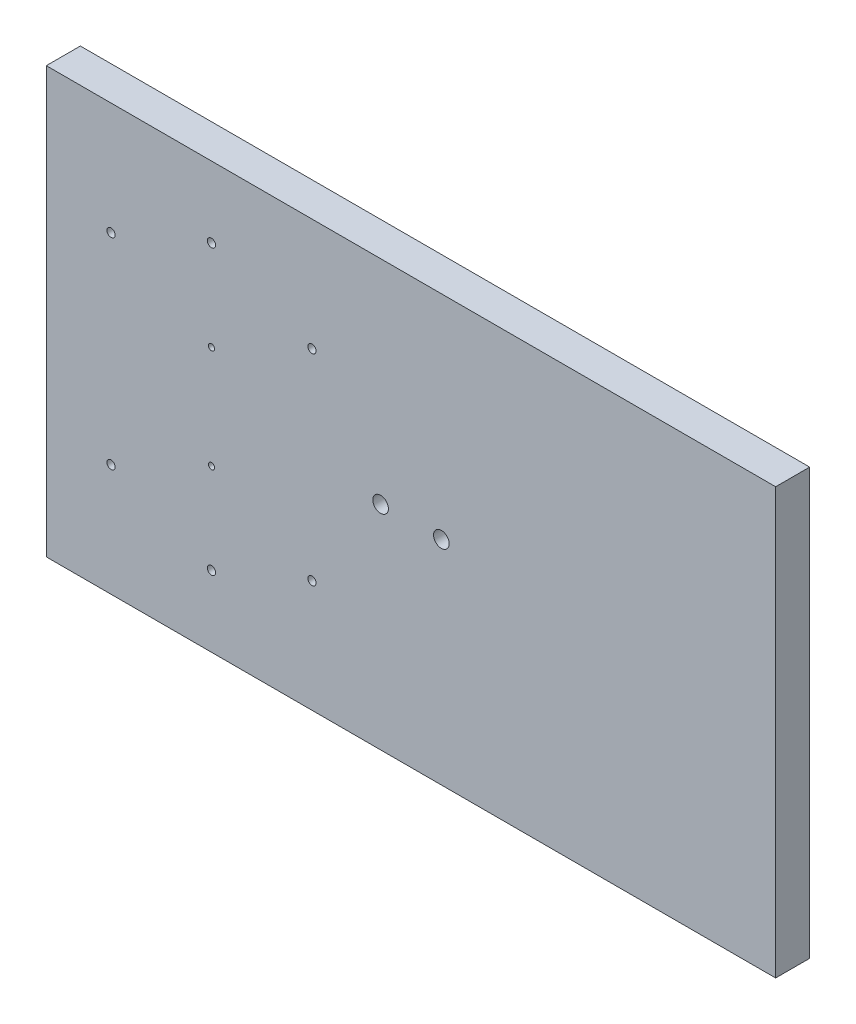
ISO-10303-21;
HEADER;
FILE_DESCRIPTION(('STEP AP214'),'2;1');
FILE_NAME('part.step','',(''),(''),'','','');
FILE_SCHEMA(('AUTOMOTIVE_DESIGN { 1 0 10303 214 1 1 1 1 }'));
ENDSEC;
DATA;
#1=APPLICATION_CONTEXT('core data for automotive mechanical design processes');
#2=APPLICATION_PROTOCOL_DEFINITION('international standard','automotive_design',2000,#1);
#3=PRODUCT_CONTEXT('',#1,'mechanical');
#4=PRODUCT('Part','Part','',(#3));
#5=PRODUCT_RELATED_PRODUCT_CATEGORY('part','',(#4));
#6=PRODUCT_DEFINITION_FORMATION('','',#4);
#7=PRODUCT_DEFINITION_CONTEXT('part definition',#1,'design');
#8=PRODUCT_DEFINITION('design','',#6,#7);
#9=PRODUCT_DEFINITION_SHAPE('','',#8);
#10=(LENGTH_UNIT() NAMED_UNIT(*) SI_UNIT(.MILLI.,.METRE.));
#11=(NAMED_UNIT(*) PLANE_ANGLE_UNIT() SI_UNIT($,.RADIAN.));
#12=(NAMED_UNIT(*) SI_UNIT($,.STERADIAN.) SOLID_ANGLE_UNIT());
#13=UNCERTAINTY_MEASURE_WITH_UNIT(LENGTH_MEASURE(1.E-05),#10,'distance_accuracy_value','');
#14=(GEOMETRIC_REPRESENTATION_CONTEXT(3) GLOBAL_UNCERTAINTY_ASSIGNED_CONTEXT((#13)) GLOBAL_UNIT_ASSIGNED_CONTEXT((#10,
#11,#12)) REPRESENTATION_CONTEXT('',''));
#15=CARTESIAN_POINT('',(0.,0.,0.));
#16=DIRECTION('',(0.,0.,1.));
#17=DIRECTION('',(1.,0.,0.));
#18=AXIS2_PLACEMENT_3D('',#15,#16,#17);
#19=CARTESIAN_POINT('',(152.4,-88.9,14.224));
#20=DIRECTION('',(-1.,0.,0.));
#21=DIRECTION('',(0.,0.,1.));
#22=AXIS2_PLACEMENT_3D('',#19,#20,#21);
#23=PLANE('',#22);
#24=DIRECTION('',(0.,1.,0.));
#25=VECTOR('',#24,1.);
#26=CARTESIAN_POINT('',(152.4,-88.9,0.));
#27=LINE('',#26,#25);
#28=CARTESIAN_POINT('',(152.4,-88.9,0.));
#29=VERTEX_POINT('',#28);
#30=CARTESIAN_POINT('',(152.4,88.9,0.));
#31=VERTEX_POINT('',#30);
#32=EDGE_CURVE('E168',#29,#31,#27,.T.);
#33=ORIENTED_EDGE('',*,*,#32,.T.);
#34=DIRECTION('',(0.,0.,-1.));
#35=VECTOR('',#34,1.);
#36=CARTESIAN_POINT('',(152.4,88.9,14.224));
#37=LINE('',#36,#35);
#38=CARTESIAN_POINT('',(152.4,88.9,14.224));
#39=VERTEX_POINT('',#38);
#40=EDGE_CURVE('E11',#39,#31,#37,.T.);
#41=ORIENTED_EDGE('',*,*,#40,.F.);
#42=DIRECTION('',(0.,1.,0.));
#43=VECTOR('',#42,1.);
#44=CARTESIAN_POINT('',(152.4,-88.9,14.224));
#45=LINE('',#44,#43);
#46=CARTESIAN_POINT('',(152.4,-88.9,14.224));
#47=VERTEX_POINT('',#46);
#48=EDGE_CURVE('E169',#47,#39,#45,.T.);
#49=ORIENTED_EDGE('',*,*,#48,.F.);
#50=DIRECTION('',(0.,0.,-1.));
#51=VECTOR('',#50,1.);
#52=CARTESIAN_POINT('',(152.4,-88.9,14.224));
#53=LINE('',#52,#51);
#54=EDGE_CURVE('E175',#47,#29,#53,.T.);
#55=ORIENTED_EDGE('',*,*,#54,.T.);
#56=EDGE_LOOP('',(#33,#41,#49,#55));
#57=FACE_BOUND('',#56,.T.);
#58=ADVANCED_FACE('F37',(#57),#23,.F.);
#59=CARTESIAN_POINT('',(-152.4,88.9,14.224));
#60=DIRECTION('',(0.,-1.,0.));
#61=DIRECTION('',(0.,0.,-1.));
#62=AXIS2_PLACEMENT_3D('',#59,#60,#61);
#63=PLANE('',#62);
#64=DIRECTION('',(-1.,0.,0.));
#65=VECTOR('',#64,1.);
#66=CARTESIAN_POINT('',(-152.4,88.9,0.));
#67=LINE('',#66,#65);
#68=CARTESIAN_POINT('',(-152.4,88.9,0.));
#69=VERTEX_POINT('',#68);
#70=EDGE_CURVE('E178',#31,#69,#67,.T.);
#71=ORIENTED_EDGE('',*,*,#70,.T.);
#72=DIRECTION('',(0.,0.,-1.));
#73=VECTOR('',#72,1.);
#74=CARTESIAN_POINT('',(-152.4,88.9,14.224));
#75=LINE('',#74,#73);
#76=CARTESIAN_POINT('',(-152.4,88.9,14.224));
#77=VERTEX_POINT('',#76);
#78=EDGE_CURVE('E45',#77,#69,#75,.T.);
#79=ORIENTED_EDGE('',*,*,#78,.F.);
#80=DIRECTION('',(-1.,0.,0.));
#81=VECTOR('',#80,1.);
#82=CARTESIAN_POINT('',(-152.4,88.9,14.224));
#83=LINE('',#82,#81);
#84=EDGE_CURVE('E84',#39,#77,#83,.T.);
#85=ORIENTED_EDGE('',*,*,#84,.F.);
#86=ORIENTED_EDGE('',*,*,#40,.T.);
#87=EDGE_LOOP('',(#71,#79,#85,#86));
#88=FACE_BOUND('',#87,.T.);
#89=ADVANCED_FACE('F202',(#88),#63,.F.);
#90=CARTESIAN_POINT('',(-152.4,-88.9,14.224));
#91=DIRECTION('',(1.,0.,0.));
#92=DIRECTION('',(0.,0.,-1.));
#93=AXIS2_PLACEMENT_3D('',#90,#91,#92);
#94=PLANE('',#93);
#95=DIRECTION('',(0.,-1.,0.));
#96=VECTOR('',#95,1.);
#97=CARTESIAN_POINT('',(-152.4,-88.9,0.));
#98=LINE('',#97,#96);
#99=CARTESIAN_POINT('',(-152.4,-88.9,0.));
#100=VERTEX_POINT('',#99);
#101=EDGE_CURVE('E71',#69,#100,#98,.T.);
#102=ORIENTED_EDGE('',*,*,#101,.T.);
#103=DIRECTION('',(0.,0.,-1.));
#104=VECTOR('',#103,1.);
#105=CARTESIAN_POINT('',(-152.4,-88.9,14.224));
#106=LINE('',#105,#104);
#107=CARTESIAN_POINT('',(-152.4,-88.9,14.224));
#108=VERTEX_POINT('',#107);
#109=EDGE_CURVE('E183',#108,#100,#106,.T.);
#110=ORIENTED_EDGE('',*,*,#109,.F.);
#111=DIRECTION('',(0.,-1.,0.));
#112=VECTOR('',#111,1.);
#113=CARTESIAN_POINT('',(-152.4,-88.9,14.224));
#114=LINE('',#113,#112);
#115=EDGE_CURVE('E172',#77,#108,#114,.T.);
#116=ORIENTED_EDGE('',*,*,#115,.F.);
#117=ORIENTED_EDGE('',*,*,#78,.T.);
#118=EDGE_LOOP('',(#102,#110,#116,#117));
#119=FACE_BOUND('',#118,.T.);
#120=ADVANCED_FACE('F185',(#119),#94,.F.);
#121=CARTESIAN_POINT('',(-152.4,-88.9,14.224));
#122=DIRECTION('',(0.,1.,0.));
#123=DIRECTION('',(0.,0.,1.));
#124=AXIS2_PLACEMENT_3D('',#121,#122,#123);
#125=PLANE('',#124);
#126=DIRECTION('',(1.,0.,0.));
#127=VECTOR('',#126,1.);
#128=CARTESIAN_POINT('',(-152.4,-88.9,0.));
#129=LINE('',#128,#127);
#130=EDGE_CURVE('E77',#100,#29,#129,.T.);
#131=ORIENTED_EDGE('',*,*,#130,.T.);
#132=ORIENTED_EDGE('',*,*,#54,.F.);
#133=DIRECTION('',(1.,0.,0.));
#134=VECTOR('',#133,1.);
#135=CARTESIAN_POINT('',(-152.4,-88.9,14.224));
#136=LINE('',#135,#134);
#137=EDGE_CURVE('E53',#108,#47,#136,.T.);
#138=ORIENTED_EDGE('',*,*,#137,.F.);
#139=ORIENTED_EDGE('',*,*,#109,.T.);
#140=EDGE_LOOP('',(#131,#132,#138,#139));
#141=FACE_BOUND('',#140,.T.);
#142=ADVANCED_FACE('F192',(#141),#125,.F.);
#143=CARTESIAN_POINT('',(0.,0.,14.224));
#144=DIRECTION('',(0.,0.,-1.));
#145=DIRECTION('',(-1.,0.,0.));
#146=AXIS2_PLACEMENT_3D('',#143,#144,#145);
#147=PLANE('',#146);
#148=CARTESIAN_POINT('',(12.7000000000001,0.,14.224));
#149=DIRECTION('',(0.,0.,-1.));
#150=DIRECTION('',(-1.,0.,0.));
#151=AXIS2_PLACEMENT_3D('',#148,#149,#150);
#152=CIRCLE('',#151,3.2639);
#153=CARTESIAN_POINT('',(9.43610000000008,0.,14.224));
#154=VERTEX_POINT('',#153);
#155=EDGE_CURVE('E413',#154,#154,#152,.T.);
#156=ORIENTED_EDGE('',*,*,#155,.T.);
#157=EDGE_LOOP('',(#156));
#158=FACE_BOUND('',#157,.T.);
#159=CARTESIAN_POINT('',(-12.6999999999999,0.,14.224));
#160=DIRECTION('',(0.,0.,-1.));
#161=DIRECTION('',(-1.,0.,0.));
#162=AXIS2_PLACEMENT_3D('',#159,#160,#161);
#163=CIRCLE('',#162,3.2639);
#164=CARTESIAN_POINT('',(-15.9638999999999,0.,14.224));
#165=VERTEX_POINT('',#164);
#166=EDGE_CURVE('E126',#165,#165,#163,.T.);
#167=ORIENTED_EDGE('',*,*,#166,.T.);
#168=EDGE_LOOP('',(#167));
#169=FACE_BOUND('',#168,.T.);
#170=CARTESIAN_POINT('',(-83.375,21.5,14.224));
#171=DIRECTION('',(0.,0.,1.));
#172=DIRECTION('',(1.,0.,0.));
#173=AXIS2_PLACEMENT_3D('',#170,#171,#172);
#174=CIRCLE('',#173,1.28905);
#175=CARTESIAN_POINT('',(-82.08595,21.5,14.224));
#176=VERTEX_POINT('',#175);
#177=EDGE_CURVE('E120',#176,#176,#174,.T.);
#178=ORIENTED_EDGE('',*,*,#177,.F.);
#179=EDGE_LOOP('',(#178));
#180=FACE_BOUND('',#179,.T.);
#181=CARTESIAN_POINT('',(-83.375,-21.5,14.224));
#182=DIRECTION('',(0.,0.,1.));
#183=DIRECTION('',(1.,0.,0.));
#184=AXIS2_PLACEMENT_3D('',#181,#182,#183);
#185=CIRCLE('',#184,1.28905);
#186=CARTESIAN_POINT('',(-82.08595,-21.5,14.224));
#187=VERTEX_POINT('',#186);
#188=EDGE_CURVE('E119',#187,#187,#185,.T.);
#189=ORIENTED_EDGE('',*,*,#188,.F.);
#190=EDGE_LOOP('',(#189));
#191=FACE_BOUND('',#190,.T.);
#192=CARTESIAN_POINT('',(-41.39,41.985,14.224));
#193=DIRECTION('',(0.,0.,1.));
#194=DIRECTION('',(1.,0.,0.));
#195=AXIS2_PLACEMENT_3D('',#192,#193,#194);
#196=CIRCLE('',#195,1.72719999999999);
#197=CARTESIAN_POINT('',(-39.6628,41.985,14.224));
#198=VERTEX_POINT('',#197);
#199=EDGE_CURVE('E132',#198,#198,#196,.T.);
#200=ORIENTED_EDGE('',*,*,#199,.F.);
#201=EDGE_LOOP('',(#200));
#202=FACE_BOUND('',#201,.T.);
#203=CARTESIAN_POINT('',(-41.39,-41.985,14.224));
#204=DIRECTION('',(0.,0.,1.));
#205=DIRECTION('',(1.,0.,0.));
#206=AXIS2_PLACEMENT_3D('',#203,#204,#205);
#207=CIRCLE('',#206,1.72719999999999);
#208=CARTESIAN_POINT('',(-39.6628,-41.985,14.224));
#209=VERTEX_POINT('',#208);
#210=EDGE_CURVE('E138',#209,#209,#207,.T.);
#211=ORIENTED_EDGE('',*,*,#210,.F.);
#212=EDGE_LOOP('',(#211));
#213=FACE_BOUND('',#212,.T.);
#214=CARTESIAN_POINT('',(-125.36,-41.985,14.224));
#215=DIRECTION('',(0.,0.,1.));
#216=DIRECTION('',(1.,0.,0.));
#217=AXIS2_PLACEMENT_3D('',#214,#215,#216);
#218=CIRCLE('',#217,1.72719999999998);
#219=CARTESIAN_POINT('',(-123.6328,-41.985,14.224));
#220=VERTEX_POINT('',#219);
#221=EDGE_CURVE('E144',#220,#220,#218,.T.);
#222=ORIENTED_EDGE('',*,*,#221,.F.);
#223=EDGE_LOOP('',(#222));
#224=FACE_BOUND('',#223,.T.);
#225=CARTESIAN_POINT('',(-125.36,41.985,14.224));
#226=DIRECTION('',(0.,0.,1.));
#227=DIRECTION('',(1.,0.,0.));
#228=AXIS2_PLACEMENT_3D('',#225,#226,#227);
#229=CIRCLE('',#228,1.72719999999998);
#230=CARTESIAN_POINT('',(-123.6328,41.985,14.224));
#231=VERTEX_POINT('',#230);
#232=EDGE_CURVE('E150',#231,#231,#229,.T.);
#233=ORIENTED_EDGE('',*,*,#232,.F.);
#234=EDGE_LOOP('',(#233));
#235=FACE_BOUND('',#234,.T.);
#236=CARTESIAN_POINT('',(-83.375,59.2455,14.224));
#237=DIRECTION('',(0.,0.,1.));
#238=DIRECTION('',(1.,0.,0.));
#239=AXIS2_PLACEMENT_3D('',#236,#237,#238);
#240=CIRCLE('',#239,1.72719999999998);
#241=CARTESIAN_POINT('',(-81.6478,59.2455,14.224));
#242=VERTEX_POINT('',#241);
#243=EDGE_CURVE('E156',#242,#242,#240,.T.);
#244=ORIENTED_EDGE('',*,*,#243,.F.);
#245=EDGE_LOOP('',(#244));
#246=FACE_BOUND('',#245,.T.);
#247=CARTESIAN_POINT('',(-83.3750000000001,-59.2455,14.224));
#248=DIRECTION('',(0.,0.,1.));
#249=DIRECTION('',(1.,0.,0.));
#250=AXIS2_PLACEMENT_3D('',#247,#248,#249);
#251=CIRCLE('',#250,1.72719999999998);
#252=CARTESIAN_POINT('',(-81.6478000000001,-59.2455,14.224));
#253=VERTEX_POINT('',#252);
#254=EDGE_CURVE('E162',#253,#253,#251,.T.);
#255=ORIENTED_EDGE('',*,*,#254,.F.);
#256=EDGE_LOOP('',(#255));
#257=FACE_BOUND('',#256,.T.);
#258=ORIENTED_EDGE('',*,*,#48,.T.);
#259=ORIENTED_EDGE('',*,*,#84,.T.);
#260=ORIENTED_EDGE('',*,*,#115,.T.);
#261=ORIENTED_EDGE('',*,*,#137,.T.);
#262=EDGE_LOOP('',(#258,#259,#260,#261));
#263=FACE_BOUND('',#262,.T.);
#264=ADVANCED_FACE('F194',(#158,#169,#180,#191,#202,#213,#224,#235,#246,#257,#263),#147,.F.);
#265=CARTESIAN_POINT('',(0.,0.,0.));
#266=DIRECTION('',(0.,0.,-1.));
#267=DIRECTION('',(-1.,0.,0.));
#268=AXIS2_PLACEMENT_3D('',#265,#266,#267);
#269=PLANE('',#268);
#270=CARTESIAN_POINT('',(12.7000000000001,0.,0.));
#271=DIRECTION('',(0.,0.,-1.));
#272=DIRECTION('',(-1.,0.,0.));
#273=AXIS2_PLACEMENT_3D('',#270,#271,#272);
#274=CIRCLE('',#273,3.2639);
#275=CARTESIAN_POINT('',(9.43610000000008,0.,0.));
#276=VERTEX_POINT('',#275);
#277=EDGE_CURVE('E416',#276,#276,#274,.T.);
#278=ORIENTED_EDGE('',*,*,#277,.F.);
#279=EDGE_LOOP('',(#278));
#280=FACE_BOUND('',#279,.T.);
#281=CARTESIAN_POINT('',(-12.6999999999999,0.,0.));
#282=DIRECTION('',(0.,0.,-1.));
#283=DIRECTION('',(-1.,0.,0.));
#284=AXIS2_PLACEMENT_3D('',#281,#282,#283);
#285=CIRCLE('',#284,3.2639);
#286=CARTESIAN_POINT('',(-15.9638999999999,0.,0.));
#287=VERTEX_POINT('',#286);
#288=EDGE_CURVE('E418',#287,#287,#285,.T.);
#289=ORIENTED_EDGE('',*,*,#288,.F.);
#290=EDGE_LOOP('',(#289));
#291=FACE_BOUND('',#290,.T.);
#292=ORIENTED_EDGE('',*,*,#32,.F.);
#293=ORIENTED_EDGE('',*,*,#130,.F.);
#294=ORIENTED_EDGE('',*,*,#101,.F.);
#295=ORIENTED_EDGE('',*,*,#70,.F.);
#296=EDGE_LOOP('',(#292,#293,#294,#295));
#297=FACE_BOUND('',#296,.T.);
#298=ADVANCED_FACE('F188',(#280,#291,#297),#269,.T.);
#299=CARTESIAN_POINT('',(-83.3750000000001,-59.2455,6.35));
#300=DIRECTION('',(0.,0.,1.));
#301=DIRECTION('',(1.,0.,0.));
#302=AXIS2_PLACEMENT_3D('',#299,#300,#301);
#303=CONICAL_SURFACE('',#302,1.7272,1.02974425867665);
#304=CARTESIAN_POINT('',(-83.3750000000001,-59.2455,5.3121935388156));
#305=VERTEX_POINT('',#304);
#306=VERTEX_LOOP('',#305);
#307=FACE_BOUND('',#306,.T.);
#308=CARTESIAN_POINT('',(-83.3750000000001,-59.2455,6.35));
#309=DIRECTION('',(0.,0.,1.));
#310=DIRECTION('',(1.,0.,0.));
#311=AXIS2_PLACEMENT_3D('',#308,#309,#310);
#312=CIRCLE('',#311,1.7272);
#313=CARTESIAN_POINT('',(-81.6478000000001,-59.2455,6.35));
#314=VERTEX_POINT('',#313);
#315=EDGE_CURVE('E165',#314,#314,#312,.T.);
#316=ORIENTED_EDGE('',*,*,#315,.T.);
#317=EDGE_LOOP('',(#316));
#318=FACE_BOUND('',#317,.T.);
#319=ADVANCED_FACE('F225',(#307,#318),#303,.F.);
#320=CARTESIAN_POINT('',(-83.3750000000001,-59.2455,14.224));
#321=DIRECTION('',(0.,0.,1.));
#322=DIRECTION('',(1.,0.,0.));
#323=AXIS2_PLACEMENT_3D('',#320,#321,#322);
#324=CYLINDRICAL_SURFACE('',#323,1.72719999999999);
#325=ORIENTED_EDGE('',*,*,#315,.F.);
#326=EDGE_LOOP('',(#325));
#327=FACE_BOUND('',#326,.T.);
#328=ORIENTED_EDGE('',*,*,#254,.T.);
#329=EDGE_LOOP('',(#328));
#330=FACE_BOUND('',#329,.T.);
#331=ADVANCED_FACE('F230',(#327,#330),#324,.F.);
#332=CARTESIAN_POINT('',(-83.375,59.2455,6.35));
#333=DIRECTION('',(0.,0.,1.));
#334=DIRECTION('',(1.,0.,0.));
#335=AXIS2_PLACEMENT_3D('',#332,#333,#334);
#336=CONICAL_SURFACE('',#335,1.7272,1.02974425867665);
#337=CARTESIAN_POINT('',(-83.375,59.2455,5.3121935388156));
#338=VERTEX_POINT('',#337);
#339=VERTEX_LOOP('',#338);
#340=FACE_BOUND('',#339,.T.);
#341=CARTESIAN_POINT('',(-83.375,59.2455,6.35));
#342=DIRECTION('',(0.,0.,1.));
#343=DIRECTION('',(1.,0.,0.));
#344=AXIS2_PLACEMENT_3D('',#341,#342,#343);
#345=CIRCLE('',#344,1.7272);
#346=CARTESIAN_POINT('',(-81.6478,59.2455,6.35));
#347=VERTEX_POINT('',#346);
#348=EDGE_CURVE('E159',#347,#347,#345,.T.);
#349=ORIENTED_EDGE('',*,*,#348,.T.);
#350=EDGE_LOOP('',(#349));
#351=FACE_BOUND('',#350,.T.);
#352=ADVANCED_FACE('F242',(#340,#351),#336,.F.);
#353=CARTESIAN_POINT('',(-83.375,59.2455,14.224));
#354=DIRECTION('',(0.,0.,1.));
#355=DIRECTION('',(1.,0.,0.));
#356=AXIS2_PLACEMENT_3D('',#353,#354,#355);
#357=CYLINDRICAL_SURFACE('',#356,1.72719999999999);
#358=ORIENTED_EDGE('',*,*,#348,.F.);
#359=EDGE_LOOP('',(#358));
#360=FACE_BOUND('',#359,.T.);
#361=ORIENTED_EDGE('',*,*,#243,.T.);
#362=EDGE_LOOP('',(#361));
#363=FACE_BOUND('',#362,.T.);
#364=ADVANCED_FACE('F252',(#360,#363),#357,.F.);
#365=CARTESIAN_POINT('',(-125.36,41.985,6.35));
#366=DIRECTION('',(0.,0.,1.));
#367=DIRECTION('',(1.,0.,0.));
#368=AXIS2_PLACEMENT_3D('',#365,#366,#367);
#369=CONICAL_SURFACE('',#368,1.7272,1.02974425867665);
#370=CARTESIAN_POINT('',(-125.36,41.985,5.3121935388156));
#371=VERTEX_POINT('',#370);
#372=VERTEX_LOOP('',#371);
#373=FACE_BOUND('',#372,.T.);
#374=CARTESIAN_POINT('',(-125.36,41.985,6.35));
#375=DIRECTION('',(0.,0.,1.));
#376=DIRECTION('',(1.,0.,0.));
#377=AXIS2_PLACEMENT_3D('',#374,#375,#376);
#378=CIRCLE('',#377,1.7272);
#379=CARTESIAN_POINT('',(-123.6328,41.985,6.35));
#380=VERTEX_POINT('',#379);
#381=EDGE_CURVE('E153',#380,#380,#378,.T.);
#382=ORIENTED_EDGE('',*,*,#381,.T.);
#383=EDGE_LOOP('',(#382));
#384=FACE_BOUND('',#383,.T.);
#385=ADVANCED_FACE('F262',(#373,#384),#369,.F.);
#386=CARTESIAN_POINT('',(-125.36,41.985,14.224));
#387=DIRECTION('',(0.,0.,1.));
#388=DIRECTION('',(1.,0.,0.));
#389=AXIS2_PLACEMENT_3D('',#386,#387,#388);
#390=CYLINDRICAL_SURFACE('',#389,1.72719999999999);
#391=ORIENTED_EDGE('',*,*,#381,.F.);
#392=EDGE_LOOP('',(#391));
#393=FACE_BOUND('',#392,.T.);
#394=ORIENTED_EDGE('',*,*,#232,.T.);
#395=EDGE_LOOP('',(#394));
#396=FACE_BOUND('',#395,.T.);
#397=ADVANCED_FACE('F272',(#393,#396),#390,.F.);
#398=CARTESIAN_POINT('',(-125.36,-41.985,6.35));
#399=DIRECTION('',(0.,0.,1.));
#400=DIRECTION('',(1.,0.,0.));
#401=AXIS2_PLACEMENT_3D('',#398,#399,#400);
#402=CONICAL_SURFACE('',#401,1.7272,1.02974425867665);
#403=CARTESIAN_POINT('',(-125.36,-41.985,5.3121935388156));
#404=VERTEX_POINT('',#403);
#405=VERTEX_LOOP('',#404);
#406=FACE_BOUND('',#405,.T.);
#407=CARTESIAN_POINT('',(-125.36,-41.985,6.35));
#408=DIRECTION('',(0.,0.,1.));
#409=DIRECTION('',(1.,0.,0.));
#410=AXIS2_PLACEMENT_3D('',#407,#408,#409);
#411=CIRCLE('',#410,1.7272);
#412=CARTESIAN_POINT('',(-123.6328,-41.985,6.35));
#413=VERTEX_POINT('',#412);
#414=EDGE_CURVE('E147',#413,#413,#411,.T.);
#415=ORIENTED_EDGE('',*,*,#414,.T.);
#416=EDGE_LOOP('',(#415));
#417=FACE_BOUND('',#416,.T.);
#418=ADVANCED_FACE('F282',(#406,#417),#402,.F.);
#419=CARTESIAN_POINT('',(-125.36,-41.985,14.224));
#420=DIRECTION('',(0.,0.,1.));
#421=DIRECTION('',(1.,0.,0.));
#422=AXIS2_PLACEMENT_3D('',#419,#420,#421);
#423=CYLINDRICAL_SURFACE('',#422,1.72719999999999);
#424=ORIENTED_EDGE('',*,*,#414,.F.);
#425=EDGE_LOOP('',(#424));
#426=FACE_BOUND('',#425,.T.);
#427=ORIENTED_EDGE('',*,*,#221,.T.);
#428=EDGE_LOOP('',(#427));
#429=FACE_BOUND('',#428,.T.);
#430=ADVANCED_FACE('F292',(#426,#429),#423,.F.);
#431=CARTESIAN_POINT('',(-41.39,-41.985,6.35));
#432=DIRECTION('',(0.,0.,1.));
#433=DIRECTION('',(1.,0.,0.));
#434=AXIS2_PLACEMENT_3D('',#431,#432,#433);
#435=CONICAL_SURFACE('',#434,1.7272,1.02974425867665);
#436=CARTESIAN_POINT('',(-41.39,-41.985,5.3121935388156));
#437=VERTEX_POINT('',#436);
#438=VERTEX_LOOP('',#437);
#439=FACE_BOUND('',#438,.T.);
#440=CARTESIAN_POINT('',(-41.39,-41.985,6.35));
#441=DIRECTION('',(0.,0.,1.));
#442=DIRECTION('',(1.,0.,0.));
#443=AXIS2_PLACEMENT_3D('',#440,#441,#442);
#444=CIRCLE('',#443,1.7272);
#445=CARTESIAN_POINT('',(-39.6628,-41.985,6.35));
#446=VERTEX_POINT('',#445);
#447=EDGE_CURVE('E141',#446,#446,#444,.T.);
#448=ORIENTED_EDGE('',*,*,#447,.T.);
#449=EDGE_LOOP('',(#448));
#450=FACE_BOUND('',#449,.T.);
#451=ADVANCED_FACE('F302',(#439,#450),#435,.F.);
#452=CARTESIAN_POINT('',(-41.39,-41.985,14.224));
#453=DIRECTION('',(0.,0.,1.));
#454=DIRECTION('',(1.,0.,0.));
#455=AXIS2_PLACEMENT_3D('',#452,#453,#454);
#456=CYLINDRICAL_SURFACE('',#455,1.72719999999999);
#457=ORIENTED_EDGE('',*,*,#447,.F.);
#458=EDGE_LOOP('',(#457));
#459=FACE_BOUND('',#458,.T.);
#460=ORIENTED_EDGE('',*,*,#210,.T.);
#461=EDGE_LOOP('',(#460));
#462=FACE_BOUND('',#461,.T.);
#463=ADVANCED_FACE('F312',(#459,#462),#456,.F.);
#464=CARTESIAN_POINT('',(-41.39,41.985,6.35));
#465=DIRECTION('',(0.,0.,1.));
#466=DIRECTION('',(1.,0.,0.));
#467=AXIS2_PLACEMENT_3D('',#464,#465,#466);
#468=CONICAL_SURFACE('',#467,1.7272,1.02974425867665);
#469=CARTESIAN_POINT('',(-41.39,41.985,5.3121935388156));
#470=VERTEX_POINT('',#469);
#471=VERTEX_LOOP('',#470);
#472=FACE_BOUND('',#471,.T.);
#473=CARTESIAN_POINT('',(-41.39,41.985,6.35));
#474=DIRECTION('',(0.,0.,1.));
#475=DIRECTION('',(1.,0.,0.));
#476=AXIS2_PLACEMENT_3D('',#473,#474,#475);
#477=CIRCLE('',#476,1.7272);
#478=CARTESIAN_POINT('',(-39.6628,41.985,6.35));
#479=VERTEX_POINT('',#478);
#480=EDGE_CURVE('E135',#479,#479,#477,.T.);
#481=ORIENTED_EDGE('',*,*,#480,.T.);
#482=EDGE_LOOP('',(#481));
#483=FACE_BOUND('',#482,.T.);
#484=ADVANCED_FACE('F322',(#472,#483),#468,.F.);
#485=CARTESIAN_POINT('',(-41.39,41.985,14.224));
#486=DIRECTION('',(0.,0.,1.));
#487=DIRECTION('',(1.,0.,0.));
#488=AXIS2_PLACEMENT_3D('',#485,#486,#487);
#489=CYLINDRICAL_SURFACE('',#488,1.72719999999999);
#490=ORIENTED_EDGE('',*,*,#480,.F.);
#491=EDGE_LOOP('',(#490));
#492=FACE_BOUND('',#491,.T.);
#493=ORIENTED_EDGE('',*,*,#199,.T.);
#494=EDGE_LOOP('',(#493));
#495=FACE_BOUND('',#494,.T.);
#496=ADVANCED_FACE('F332',(#492,#495),#489,.F.);
#497=CARTESIAN_POINT('',(-83.375,-21.5,6.35));
#498=DIRECTION('',(0.,0.,1.));
#499=DIRECTION('',(1.,0.,0.));
#500=AXIS2_PLACEMENT_3D('',#497,#498,#499);
#501=CONICAL_SURFACE('',#500,1.28905,1.02974425867665);
#502=CARTESIAN_POINT('',(-83.375,-21.5,5.57546061904252));
#503=VERTEX_POINT('',#502);
#504=VERTEX_LOOP('',#503);
#505=FACE_BOUND('',#504,.T.);
#506=CARTESIAN_POINT('',(-83.375,-21.5,6.35));
#507=DIRECTION('',(0.,0.,1.));
#508=DIRECTION('',(1.,0.,0.));
#509=AXIS2_PLACEMENT_3D('',#506,#507,#508);
#510=CIRCLE('',#509,1.28905);
#511=CARTESIAN_POINT('',(-82.08595,-21.5,6.35));
#512=VERTEX_POINT('',#511);
#513=EDGE_CURVE('E123',#512,#512,#510,.T.);
#514=ORIENTED_EDGE('',*,*,#513,.T.);
#515=EDGE_LOOP('',(#514));
#516=FACE_BOUND('',#515,.T.);
#517=ADVANCED_FACE('F342',(#505,#516),#501,.F.);
#518=CARTESIAN_POINT('',(-83.375,-21.5,14.224));
#519=DIRECTION('',(0.,0.,1.));
#520=DIRECTION('',(1.,0.,0.));
#521=AXIS2_PLACEMENT_3D('',#518,#519,#520);
#522=CYLINDRICAL_SURFACE('',#521,1.28905);
#523=ORIENTED_EDGE('',*,*,#513,.F.);
#524=EDGE_LOOP('',(#523));
#525=FACE_BOUND('',#524,.T.);
#526=ORIENTED_EDGE('',*,*,#188,.T.);
#527=EDGE_LOOP('',(#526));
#528=FACE_BOUND('',#527,.T.);
#529=ADVANCED_FACE('F113',(#525,#528),#522,.F.);
#530=CARTESIAN_POINT('',(-83.375,21.5,6.35));
#531=DIRECTION('',(0.,0.,1.));
#532=DIRECTION('',(1.,0.,0.));
#533=AXIS2_PLACEMENT_3D('',#530,#531,#532);
#534=CONICAL_SURFACE('',#533,1.28905,1.02974425867665);
#535=CARTESIAN_POINT('',(-83.375,21.5,5.57546061904252));
#536=VERTEX_POINT('',#535);
#537=VERTEX_LOOP('',#536);
#538=FACE_BOUND('',#537,.T.);
#539=CARTESIAN_POINT('',(-83.375,21.5,6.35));
#540=DIRECTION('',(0.,0.,1.));
#541=DIRECTION('',(1.,0.,0.));
#542=AXIS2_PLACEMENT_3D('',#539,#540,#541);
#543=CIRCLE('',#542,1.28905);
#544=CARTESIAN_POINT('',(-82.08595,21.5,6.35));
#545=VERTEX_POINT('',#544);
#546=EDGE_CURVE('E117',#545,#545,#543,.T.);
#547=ORIENTED_EDGE('',*,*,#546,.T.);
#548=EDGE_LOOP('',(#547));
#549=FACE_BOUND('',#548,.T.);
#550=ADVANCED_FACE('F109',(#538,#549),#534,.F.);
#551=CARTESIAN_POINT('',(-83.375,21.5,14.224));
#552=DIRECTION('',(0.,0.,1.));
#553=DIRECTION('',(1.,0.,0.));
#554=AXIS2_PLACEMENT_3D('',#551,#552,#553);
#555=CYLINDRICAL_SURFACE('',#554,1.28905);
#556=ORIENTED_EDGE('',*,*,#546,.F.);
#557=EDGE_LOOP('',(#556));
#558=FACE_BOUND('',#557,.T.);
#559=ORIENTED_EDGE('',*,*,#177,.T.);
#560=EDGE_LOOP('',(#559));
#561=FACE_BOUND('',#560,.T.);
#562=ADVANCED_FACE('F112',(#558,#561),#555,.F.);
#563=CARTESIAN_POINT('',(-12.6999999999999,0.,0.));
#564=DIRECTION('',(0.,0.,-1.));
#565=DIRECTION('',(-1.,0.,0.));
#566=AXIS2_PLACEMENT_3D('',#563,#564,#565);
#567=CYLINDRICAL_SURFACE('',#566,3.2639);
#568=ORIENTED_EDGE('',*,*,#166,.F.);
#569=EDGE_LOOP('',(#568));
#570=FACE_BOUND('',#569,.T.);
#571=ORIENTED_EDGE('',*,*,#288,.T.);
#572=EDGE_LOOP('',(#571));
#573=FACE_BOUND('',#572,.T.);
#574=ADVANCED_FACE('F376',(#570,#573),#567,.F.);
#575=CARTESIAN_POINT('',(12.7000000000001,0.,0.));
#576=DIRECTION('',(0.,0.,-1.));
#577=DIRECTION('',(-1.,0.,0.));
#578=AXIS2_PLACEMENT_3D('',#575,#576,#577);
#579=CYLINDRICAL_SURFACE('',#578,3.2639);
#580=ORIENTED_EDGE('',*,*,#155,.F.);
#581=EDGE_LOOP('',(#580));
#582=FACE_BOUND('',#581,.T.);
#583=ORIENTED_EDGE('',*,*,#277,.T.);
#584=EDGE_LOOP('',(#583));
#585=FACE_BOUND('',#584,.T.);
#586=ADVANCED_FACE('F396',(#582,#585),#579,.F.);
#587=CLOSED_SHELL('',(#58,#89,#120,#142,#264,#298,#319,#331,#352,#364,#385,#397,#418,#430,#451,
#463,#484,#496,#517,#529,#550,#562,#574,#586));
#588=MANIFOLD_SOLID_BREP('B2',#587);
#589=ADVANCED_BREP_SHAPE_REPRESENTATION('',(#18,#588),#14);
#590=SHAPE_DEFINITION_REPRESENTATION(#9,#589);
ENDSEC;
END-ISO-10303-21;
